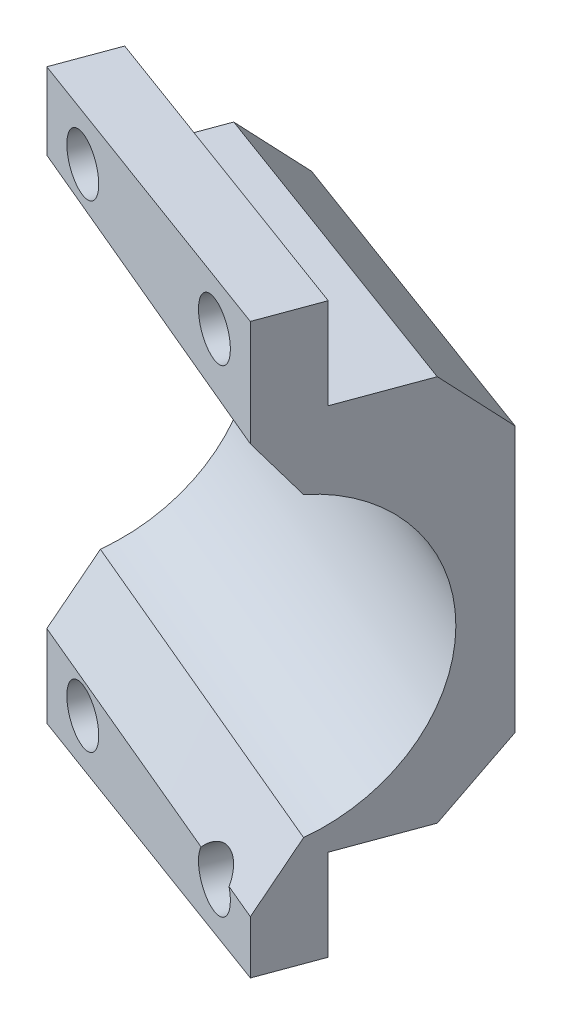
ISO-10303-21;
HEADER;
FILE_DESCRIPTION(('STEP AP214'),'2;1');
FILE_NAME('part.step','',(''),(''),'','','');
FILE_SCHEMA(('AUTOMOTIVE_DESIGN { 1 0 10303 214 1 1 1 1 }'));
ENDSEC;
DATA;
#1=APPLICATION_CONTEXT('core data for automotive mechanical design processes');
#2=APPLICATION_PROTOCOL_DEFINITION('international standard','automotive_design',2000,#1);
#3=PRODUCT_CONTEXT('',#1,'mechanical');
#4=PRODUCT('Part','Part','',(#3));
#5=PRODUCT_RELATED_PRODUCT_CATEGORY('part','',(#4));
#6=PRODUCT_DEFINITION_FORMATION('','',#4);
#7=PRODUCT_DEFINITION_CONTEXT('part definition',#1,'design');
#8=PRODUCT_DEFINITION('design','',#6,#7);
#9=PRODUCT_DEFINITION_SHAPE('','',#8);
#10=(LENGTH_UNIT() NAMED_UNIT(*) SI_UNIT(.MILLI.,.METRE.));
#11=(NAMED_UNIT(*) PLANE_ANGLE_UNIT() SI_UNIT($,.RADIAN.));
#12=(NAMED_UNIT(*) SI_UNIT($,.STERADIAN.) SOLID_ANGLE_UNIT());
#13=UNCERTAINTY_MEASURE_WITH_UNIT(LENGTH_MEASURE(1.E-05),#10,'distance_accuracy_value','');
#14=(GEOMETRIC_REPRESENTATION_CONTEXT(3) GLOBAL_UNCERTAINTY_ASSIGNED_CONTEXT((#13)) GLOBAL_UNIT_ASSIGNED_CONTEXT((#10,
#11,#12)) REPRESENTATION_CONTEXT('',''));
#15=CARTESIAN_POINT('',(0.,0.,0.));
#16=DIRECTION('',(0.,0.,1.));
#17=DIRECTION('',(1.,0.,0.));
#18=AXIS2_PLACEMENT_3D('',#15,#16,#17);
#19=CARTESIAN_POINT('',(5.20375513629735,0.,-14.1184087675292));
#20=DIRECTION('',(0.345836204768251,0.,-0.93829490005621));
#21=DIRECTION('',(-0.93829490005621,0.,-0.345836204768251));
#22=AXIS2_PLACEMENT_3D('',#19,#20,#21);
#23=PLANE('',#22);
#24=CARTESIAN_POINT('',(27.4328186314744,-21.59,-5.92523308868456));
#25=DIRECTION('',(0.345836204768251,0.,-0.93829490005621));
#26=DIRECTION('',(-0.93829490005621,0.,-0.345836204768251));
#27=AXIS2_PLACEMENT_3D('',#24,#25,#26);
#28=CIRCLE('',#27,2.25);
#29=CARTESIAN_POINT('',(25.6621337291462,-20.364749591954,-6.57787113075961));
#30=VERTEX_POINT('',#29);
#31=CARTESIAN_POINT('',(29.3712667732315,-20.6986727521681,-5.21076096649234));
#32=VERTEX_POINT('',#31);
#33=EDGE_CURVE('E65',#30,#32,#28,.F.);
#34=ORIENTED_EDGE('',*,*,#33,.F.);
#35=CARTESIAN_POINT('',(3.46373196602658,-18.366168036434,-14.7597455257054));
#36=CARTESIAN_POINT('',(13.5033515166797,-19.2701140406902,-11.0593482172398));
#37=CARTESIAN_POINT('',(23.5378133568784,-20.1735294221602,-7.36085193478292));
#38=CARTESIAN_POINT('',(33.5670066351622,-21.0764042007455,-3.66429753590347));
#39=B_SPLINE_CURVE_WITH_KNOTS('',3,(#35,#36,#37,#38),.UNSPECIFIED.,.F.,.F.,(4,4),
(4.4922717591255,4.49697220817853),.UNSPECIFIED.);
#40=CARTESIAN_POINT('',(5.20375513629734,-18.5228353608945,-14.1184087675292));
#41=VERTEX_POINT('',#40);
#42=EDGE_CURVE('E71',#30,#41,#39,.F.);
#43=ORIENTED_EDGE('',*,*,#42,.T.);
#44=DIRECTION('',(0.,1.,0.));
#45=VECTOR('',#44,1.);
#46=CARTESIAN_POINT('',(5.20375513629734,22.225,-14.1184087675292));
#47=LINE('',#46,#45);
#48=CARTESIAN_POINT('',(5.20375513629734,-25.4,-14.1184087675292));
#49=VERTEX_POINT('',#48);
#50=EDGE_CURVE('E386',#49,#41,#47,.T.);
#51=ORIENTED_EDGE('',*,*,#50,.F.);
#52=DIRECTION('',(-0.93829490005621,0.,-0.345836204768251));
#53=VECTOR('',#52,1.);
#54=CARTESIAN_POINT('',(32.19935672376,-25.4,-4.16838516846184));
#55=LINE('',#54,#53);
#56=CARTESIAN_POINT('',(32.19935672376,-25.4,-4.16838516846184));
#57=VERTEX_POINT('',#56);
#58=EDGE_CURVE('E385',#57,#49,#55,.T.);
#59=ORIENTED_EDGE('',*,*,#58,.F.);
#60=DIRECTION('',(0.,-1.,0.));
#61=VECTOR('',#60,1.);
#62=CARTESIAN_POINT('',(32.19935672376,22.225,-4.16838516846184));
#63=LINE('',#62,#61);
#64=CARTESIAN_POINT('',(32.19935672376,-20.95328156283,-4.16838516846184));
#65=VERTEX_POINT('',#64);
#66=EDGE_CURVE('E372',#65,#57,#63,.T.);
#67=ORIENTED_EDGE('',*,*,#66,.F.);
#68=CARTESIAN_POINT('',(3.46373196602658,-18.366168036434,-14.7597455257054));
#69=CARTESIAN_POINT('',(13.5033515166797,-19.2701140406902,-11.0593482172398));
#70=CARTESIAN_POINT('',(23.5378133568784,-20.1735294221602,-7.36085193478292));
#71=CARTESIAN_POINT('',(33.5670066351622,-21.0764042007455,-3.66429753590347));
#72=B_SPLINE_CURVE_WITH_KNOTS('',3,(#68,#69,#70,#71),.UNSPECIFIED.,.F.,.F.,(4,4),
(4.4922717591255,4.49697220817853),.UNSPECIFIED.);
#73=EDGE_CURVE('E163',#65,#32,#72,.F.);
#74=ORIENTED_EDGE('',*,*,#73,.T.);
#75=EDGE_LOOP('',(#34,#43,#51,#59,#67,#74));
#76=FACE_BOUND('',#75,.T.);
#77=CARTESIAN_POINT('',(9.9702932285829,-21.59,-12.3615608473065));
#78=DIRECTION('',(0.345836204768251,0.,-0.93829490005621));
#79=DIRECTION('',(-0.93829490005621,0.,-0.345836204768251));
#80=AXIS2_PLACEMENT_3D('',#77,#78,#79);
#81=CIRCLE('',#80,2.25);
#82=CARTESIAN_POINT('',(7.85912970345642,-21.59,-13.1396923080351));
#83=VERTEX_POINT('',#82);
#84=EDGE_CURVE('E674',#83,#83,#81,.T.);
#85=ORIENTED_EDGE('',*,*,#84,.T.);
#86=EDGE_LOOP('',(#85));
#87=FACE_BOUND('',#86,.T.);
#88=ADVANCED_FACE('F45',(#76,#87),#23,.F.);
#89=CARTESIAN_POINT('',(5.20375513629734,15.8068587575069,-14.1184087675292));
#90=VERTEX_POINT('',#89);
#91=CARTESIAN_POINT('',(5.20375513629734,22.225,-14.1184087675292));
#92=VERTEX_POINT('',#91);
#93=EDGE_CURVE('E309',#90,#92,#47,.T.);
#94=ORIENTED_EDGE('',*,*,#93,.F.);
#95=CARTESIAN_POINT('',(33.9426370998361,13.1854246984861,-3.52584787120819));
#96=CARTESIAN_POINT('',(23.9118310119001,14.100453866347,-7.22299671855917));
#97=CARTESIAN_POINT('',(13.8757578604912,15.0158971815855,-10.9220868971925));
#98=CARTESIAN_POINT('',(3.83452856638758,15.9317445265315,-14.6230775239907));
#99=B_SPLINE_CURVE_WITH_KNOTS('',3,(#95,#96,#97,#98),.UNSPECIFIED.,.F.,.F.,(4,4),
(1.78564339430034,1.79034493518094),.UNSPECIFIED.);
#100=CARTESIAN_POINT('',(32.19935672376,13.3444493750907,-4.16838516846184));
#101=VERTEX_POINT('',#100);
#102=EDGE_CURVE('E58',#90,#101,#99,.F.);
#103=ORIENTED_EDGE('',*,*,#102,.T.);
#104=CARTESIAN_POINT('',(32.19935672376,22.225,-4.16838516846184));
#105=VERTEX_POINT('',#104);
#106=EDGE_CURVE('E308',#105,#101,#63,.T.);
#107=ORIENTED_EDGE('',*,*,#106,.F.);
#108=DIRECTION('',(0.93829490005621,0.,0.345836204768251));
#109=VECTOR('',#108,1.);
#110=CARTESIAN_POINT('',(32.19935672376,22.225,-4.16838516846184));
#111=LINE('',#110,#109);
#112=EDGE_CURVE('E472',#92,#105,#111,.T.);
#113=ORIENTED_EDGE('',*,*,#112,.F.);
#114=EDGE_LOOP('',(#94,#103,#107,#113));
#115=FACE_BOUND('',#114,.T.);
#116=CARTESIAN_POINT('',(27.4328186314745,18.415,-5.92523308868456));
#117=DIRECTION('',(0.345836204768251,0.,-0.93829490005621));
#118=DIRECTION('',(-0.93829490005621,0.,-0.345836204768251));
#119=AXIS2_PLACEMENT_3D('',#116,#117,#118);
#120=CIRCLE('',#119,2.25);
#121=CARTESIAN_POINT('',(25.321655106348,18.415,-6.70336454941312));
#122=VERTEX_POINT('',#121);
#123=EDGE_CURVE('E459',#122,#122,#120,.F.);
#124=ORIENTED_EDGE('',*,*,#123,.F.);
#125=EDGE_LOOP('',(#124));
#126=FACE_BOUND('',#125,.T.);
#127=CARTESIAN_POINT('',(9.9702932285829,18.415,-12.3615608473065));
#128=DIRECTION('',(0.345836204768251,0.,-0.93829490005621));
#129=DIRECTION('',(-0.93829490005621,0.,-0.345836204768251));
#130=AXIS2_PLACEMENT_3D('',#127,#128,#129);
#131=CIRCLE('',#130,2.25);
#132=CARTESIAN_POINT('',(7.85912970345643,18.415,-13.1396923080351));
#133=VERTEX_POINT('',#132);
#134=EDGE_CURVE('E450',#133,#133,#131,.T.);
#135=ORIENTED_EDGE('',*,*,#134,.T.);
#136=EDGE_LOOP('',(#135));
#137=FACE_BOUND('',#136,.T.);
#138=ADVANCED_FACE('F305',(#115,#126,#137),#23,.F.);
#139=CARTESIAN_POINT('',(-32.5094030823979,22.225,-33.4327794489562));
#140=DIRECTION('',(-0.345836204768251,0.,0.93829490005621));
#141=DIRECTION('',(0.93829490005621,0.,0.345836204768251));
#142=AXIS2_PLACEMENT_3D('',#139,#140,#141);
#143=PLANE('',#142);
#144=DIRECTION('',(0.93829490005621,0.,0.345836204768251));
#145=VECTOR('',#144,1.);
#146=CARTESIAN_POINT('',(-32.5094030823979,14.605,-33.4327794489562));
#147=LINE('',#146,#145);
#148=CARTESIAN_POINT('',(6.96060305652006,14.605,-18.8849468598148));
#149=VERTEX_POINT('',#148);
#150=CARTESIAN_POINT('',(33.9562046439827,14.605,-8.93492326074739));
#151=VERTEX_POINT('',#150);
#152=EDGE_CURVE('E491',#149,#151,#147,.T.);
#153=ORIENTED_EDGE('',*,*,#152,.F.);
#154=DIRECTION('',(0.,-1.,0.));
#155=VECTOR('',#154,1.);
#156=CARTESIAN_POINT('',(6.96060305652005,22.225,-18.8849468598148));
#157=LINE('',#156,#155);
#158=CARTESIAN_POINT('',(6.96060305652006,22.225,-18.8849468598148));
#159=VERTEX_POINT('',#158);
#160=EDGE_CURVE('E384',#159,#149,#157,.T.);
#161=ORIENTED_EDGE('',*,*,#160,.F.);
#162=DIRECTION('',(0.93829490005621,0.,0.345836204768251));
#163=VECTOR('',#162,1.);
#164=CARTESIAN_POINT('',(-32.5094030823979,22.225,-33.4327794489562));
#165=LINE('',#164,#163);
#166=CARTESIAN_POINT('',(33.9562046439827,22.225,-8.93492326074739));
#167=VERTEX_POINT('',#166);
#168=EDGE_CURVE('E480',#159,#167,#165,.T.);
#169=ORIENTED_EDGE('',*,*,#168,.T.);
#170=DIRECTION('',(0.,1.,0.));
#171=VECTOR('',#170,1.);
#172=CARTESIAN_POINT('',(33.9562046439827,22.225,-8.93492326074739));
#173=LINE('',#172,#171);
#174=EDGE_CURVE('E474',#151,#167,#173,.T.);
#175=ORIENTED_EDGE('',*,*,#174,.F.);
#176=EDGE_LOOP('',(#153,#161,#169,#175));
#177=FACE_BOUND('',#176,.T.);
#178=CARTESIAN_POINT('',(29.1896665516972,18.415,-10.6917711809701));
#179=DIRECTION('',(-0.345836204768251,0.,0.93829490005621));
#180=DIRECTION('',(0.93829490005621,0.,0.345836204768251));
#181=AXIS2_PLACEMENT_3D('',#178,#179,#180);
#182=CIRCLE('',#181,2.25);
#183=CARTESIAN_POINT('',(31.3008300768236,18.415,-9.91363972024154));
#184=VERTEX_POINT('',#183);
#185=EDGE_CURVE('E675',#184,#184,#182,.F.);
#186=ORIENTED_EDGE('',*,*,#185,.F.);
#187=EDGE_LOOP('',(#186));
#188=FACE_BOUND('',#187,.T.);
#189=CARTESIAN_POINT('',(11.7271411488056,18.415,-17.1280989395921));
#190=DIRECTION('',(-0.345836204768251,0.,0.93829490005621));
#191=DIRECTION('',(0.93829490005621,0.,0.345836204768251));
#192=AXIS2_PLACEMENT_3D('',#189,#190,#191);
#193=CIRCLE('',#192,2.25);
#194=CARTESIAN_POINT('',(13.8383046739321,18.415,-16.3499674788635));
#195=VERTEX_POINT('',#194);
#196=EDGE_CURVE('E53',#195,#195,#193,.T.);
#197=ORIENTED_EDGE('',*,*,#196,.T.);
#198=EDGE_LOOP('',(#197));
#199=FACE_BOUND('',#198,.T.);
#200=ADVANCED_FACE('F522',(#177,#188,#199),#143,.F.);
#201=CARTESIAN_POINT('',(-32.5094030823979,-25.4,-33.4327794489562));
#202=DIRECTION('',(-0.345836204768251,0.,0.93829490005621));
#203=DIRECTION('',(0.93829490005621,0.,0.345836204768251));
#204=AXIS2_PLACEMENT_3D('',#201,#202,#203);
#205=PLANE('',#204);
#206=DIRECTION('',(0.93829490005621,0.,0.345836204768251));
#207=VECTOR('',#206,1.);
#208=CARTESIAN_POINT('',(-32.5094030823979,-25.4,-33.4327794489562));
#209=LINE('',#208,#207);
#210=CARTESIAN_POINT('',(6.96060305652006,-25.4,-18.8849468598148));
#211=VERTEX_POINT('',#210);
#212=CARTESIAN_POINT('',(33.9562046439827,-25.4,-8.93492326074739));
#213=VERTEX_POINT('',#212);
#214=EDGE_CURVE('E321',#211,#213,#209,.T.);
#215=ORIENTED_EDGE('',*,*,#214,.F.);
#216=DIRECTION('',(0.,-1.,0.));
#217=VECTOR('',#216,1.);
#218=CARTESIAN_POINT('',(6.96060305652005,22.225,-18.8849468598148));
#219=LINE('',#218,#217);
#220=CARTESIAN_POINT('',(6.96060305652006,-17.78,-18.8849468598148));
#221=VERTEX_POINT('',#220);
#222=EDGE_CURVE('E463',#221,#211,#219,.T.);
#223=ORIENTED_EDGE('',*,*,#222,.F.);
#224=DIRECTION('',(0.93829490005621,0.,0.345836204768251));
#225=VECTOR('',#224,1.);
#226=CARTESIAN_POINT('',(-32.5094030823979,-17.78,-33.4327794489562));
#227=LINE('',#226,#225);
#228=CARTESIAN_POINT('',(33.9562046439827,-17.78,-8.93492326074739));
#229=VERTEX_POINT('',#228);
#230=EDGE_CURVE('E371',#221,#229,#227,.T.);
#231=ORIENTED_EDGE('',*,*,#230,.T.);
#232=DIRECTION('',(0.,1.,0.));
#233=VECTOR('',#232,1.);
#234=CARTESIAN_POINT('',(33.9562046439827,22.225,-8.93492326074739));
#235=LINE('',#234,#233);
#236=EDGE_CURVE('E449',#213,#229,#235,.T.);
#237=ORIENTED_EDGE('',*,*,#236,.F.);
#238=EDGE_LOOP('',(#215,#223,#231,#237));
#239=FACE_BOUND('',#238,.T.);
#240=CARTESIAN_POINT('',(29.1896665516972,-21.59,-10.6917711809701));
#241=DIRECTION('',(-0.345836204768251,0.,0.93829490005621));
#242=DIRECTION('',(0.93829490005621,0.,0.345836204768251));
#243=AXIS2_PLACEMENT_3D('',#240,#241,#242);
#244=CIRCLE('',#243,2.25);
#245=CARTESIAN_POINT('',(31.3008300768236,-21.59,-9.91363972024154));
#246=VERTEX_POINT('',#245);
#247=EDGE_CURVE('E165',#246,#246,#244,.F.);
#248=ORIENTED_EDGE('',*,*,#247,.F.);
#249=EDGE_LOOP('',(#248));
#250=FACE_BOUND('',#249,.T.);
#251=CARTESIAN_POINT('',(11.7271411488056,-21.59,-17.1280989395921));
#252=DIRECTION('',(-0.345836204768251,0.,0.93829490005621));
#253=DIRECTION('',(0.93829490005621,0.,0.345836204768251));
#254=AXIS2_PLACEMENT_3D('',#251,#252,#253);
#255=CIRCLE('',#254,2.25);
#256=CARTESIAN_POINT('',(13.8383046739321,-21.59,-16.3499674788635));
#257=VERTEX_POINT('',#256);
#258=EDGE_CURVE('E672',#257,#257,#255,.T.);
#259=ORIENTED_EDGE('',*,*,#258,.T.);
#260=EDGE_LOOP('',(#259));
#261=FACE_BOUND('',#260,.T.);
#262=ADVANCED_FACE('F200',(#239,#250,#261),#205,.F.);
#263=CARTESIAN_POINT('',(33.5670066351622,-21.0764042007455,-3.66429753590347));
#264=CARTESIAN_POINT('',(23.5378133568784,-20.1735294221602,-7.36085193478292));
#265=CARTESIAN_POINT('',(13.5033515166797,-19.2701140406902,-11.0593482172398));
#266=CARTESIAN_POINT('',(3.46373196602658,-18.366168036434,-14.7597455257054));
#267=CARTESIAN_POINT('',(35.1379538160594,-16.4005520931051,-6.78439877780083));
#268=CARTESIAN_POINT('',(25.1114511492865,-15.4960397642799,-10.4877972476159));
#269=CARTESIAN_POINT('',(15.079679892982,-14.5910040508271,-14.1931417316007));
#270=CARTESIAN_POINT('',(5.04275086888381,-13.685454950745,-17.9003912965337));
#271=B_SPLINE_SURFACE_WITH_KNOTS('',1,3,((#263,#264,#265,#266),(#267,#268,#269,#270)),
.UNSPECIFIED.,.F.,.F.,.F.,(2,2),(4,4),(0.,1.),(4.4922717591255,4.49697220817853),.UNSPECIFIED.);
#272=CARTESIAN_POINT('',(25.6621294918352,-20.3647565473604,-6.57787269254533));
#273=CARTESIAN_POINT('',(25.7554121974584,-20.2585146460884,-6.63164108777216));
#274=CARTESIAN_POINT('',(25.8574691335113,-20.1563358413693,-6.67965572751386));
#275=CARTESIAN_POINT('',(26.0782003819209,-19.9635909658211,-6.76177425449963));
#276=CARTESIAN_POINT('',(26.1969807828099,-19.8731067200503,-6.7957834201934));
#277=CARTESIAN_POINT('',(26.4258972472953,-19.7237940881874,-6.8420428091694));
#278=CARTESIAN_POINT('',(26.533640008799,-19.6622027971916,-6.85713528486028));
#279=CARTESIAN_POINT('',(26.7568631349381,-19.5529813804391,-6.87426391983681));
#280=CARTESIAN_POINT('',(26.8723251278852,-19.505319461112,-6.87633003707949));
#281=CARTESIAN_POINT('',(27.0496910650771,-19.4462032343245,-6.86866063265423));
#282=CARTESIAN_POINT('',(27.1098220208426,-19.4285032828833,-6.86425957115633));
#283=CARTESIAN_POINT('',(27.2308507939641,-19.3976959300964,-6.85169600050749));
#284=CARTESIAN_POINT('',(27.291748191475,-19.3845861188529,-6.84353547036587));
#285=CARTESIAN_POINT('',(27.4137689759192,-19.3632545326066,-6.82338804274732));
#286=CARTESIAN_POINT('',(27.4748923472148,-19.3550324255109,-6.81140140531879));
#287=CARTESIAN_POINT('',(27.5967243289433,-19.3436901531479,-6.78362954600775));
#288=CARTESIAN_POINT('',(27.6574330078001,-19.3405691249154,-6.76784496715322));
#289=CARTESIAN_POINT('',(27.82125429951,-19.3392176536223,-6.71981458242317));
#290=CARTESIAN_POINT('',(27.9234100676175,-19.3461297694335,-6.68390168924525));
#291=CARTESIAN_POINT('',(28.121238943341,-19.3753761184677,-6.60216278040206));
#292=CARTESIAN_POINT('',(28.2169142979926,-19.3977049756765,-6.55634022418689));
#293=CARTESIAN_POINT('',(28.3942387730919,-19.4550502831308,-6.45914537122653));
#294=CARTESIAN_POINT('',(28.4763634659916,-19.4893279261559,-6.40819844644321));
#295=CARTESIAN_POINT('',(28.630776226643,-19.5691288043763,-6.30060939799221));
#296=CARTESIAN_POINT('',(28.7030630616304,-19.614653446904,-6.24396656212381));
#297=CARTESIAN_POINT('',(28.8420734950818,-19.7190712154906,-6.12207496939455));
#298=CARTESIAN_POINT('',(28.907933945327,-19.7787261464829,-6.05649944309361));
#299=CARTESIAN_POINT('',(29.0269109364636,-19.9069466424569,-5.92232044627046));
#300=CARTESIAN_POINT('',(29.0800004551393,-19.9755306364461,-5.85371091268858));
#301=CARTESIAN_POINT('',(29.1810878382447,-20.131364298895,-5.70367532220344));
#302=CARTESIAN_POINT('',(29.2268207433501,-20.2198301565201,-5.62199355269249));
#303=CARTESIAN_POINT('',(29.3016027091709,-20.4032841635773,-5.45861830670346));
#304=CARTESIAN_POINT('',(29.3306685896978,-20.4982656288771,-5.37692492554114));
#305=CARTESIAN_POINT('',(29.3592861985037,-20.629591344229,-5.26743891645888));
#306=CARTESIAN_POINT('',(29.3657551764665,-20.6640253914846,-5.23904134714636));
#307=CARTESIAN_POINT('',(29.371266182945,-20.6986801989754,-5.21076118405995));
#308=B_SPLINE_CURVE_WITH_KNOTS('',3,(#272,#273,#274,#275,#276,#277,#278,#279,#280,#281,#282,
#283,#284,#285,#286,#287,#288,#289,#290,#291,#292,#293,#294,#295,#296,#297,#298,#299,#300,#301,
#302,#303,#304,#305,#306,#307),.UNSPECIFIED.,.F.,.F.,(4,2,2,2,2,2,2,2,2,2,2,2,2,2,2,2,2,4),(0.,
0.454203843545623,0.911431005882664,1.28502001431848,1.65774953017867,1.84601998682151,
2.03419144968865,2.2223501258595,2.41047696734788,2.73412321220879,3.05765665446004,
3.36396456043671,3.6703108140295,4.00035913514037,4.33109978615035,4.71611176536682,
5.10073451628394,5.23597847049523),.UNSPECIFIED.);
#309=EDGE_CURVE('E11',#30,#32,#308,.T.);
#310=CARTESIAN_POINT('',(32.1993567237602,-20.95328156283,-4.16838516846184));
#311=CARTESIAN_POINT('',(32.2493858908594,-20.7570539979853,-4.30412066357207));
#312=CARTESIAN_POINT('',(32.2994153387784,-20.5608269977136,-4.43985687135961));
#313=CARTESIAN_POINT('',(32.3994752453252,-20.1683723649068,-4.71133193068998));
#314=CARTESIAN_POINT('',(32.449505703958,-19.9721447323818,-4.84707078224559));
#315=CARTESIAN_POINT('',(32.5495676319295,-19.5796888350989,-5.11855112912046));
#316=CARTESIAN_POINT('',(32.5995991012731,-19.3834605703511,-5.25429262445251));
#317=CARTESIAN_POINT('',(32.6996630506748,-18.9910034086537,-5.52577825888456));
#318=CARTESIAN_POINT('',(32.7496955307379,-18.7947745117142,-5.66152239799734));
#319=CARTESIAN_POINT('',(32.8497615015742,-18.402316085664,-5.93301331999965));
#320=CARTESIAN_POINT('',(32.8997949923523,-18.2060865565633,-6.06876010290197));
#321=CARTESIAN_POINT('',(32.9998629846208,-17.8136268662212,-6.34025631248994));
#322=CARTESIAN_POINT('',(33.0498974861162,-17.61739670499,-6.47600573918839));
#323=CARTESIAN_POINT('',(33.1499674998195,-17.2249357504176,-6.74750723637576));
#324=CARTESIAN_POINT('',(33.2000030120324,-17.0287049570866,-6.88325930687748));
#325=CARTESIAN_POINT('',(33.3000750471718,-16.6362427383452,-7.15476609167844));
#326=CARTESIAN_POINT('',(33.3501115701031,-16.4400113129451,-7.29052080599045));
#327=CARTESIAN_POINT('',(33.400148373835,-16.2437804521713,-7.42627623295744));
#328=B_SPLINE_CURVE_WITH_KNOTS('',3,(#310,#311,#312,#313,#314,#315,#316,#317,#318,#319,#320,
#321,#322,#323,#324,#325,#326,#327),.UNSPECIFIED.,.F.,.F.,(4,2,2,2,2,2,2,2,4),(0.,
0.731362218454331,1.46273100190098,2.19410635032304,2.92548826370239,3.65687674202213,
4.38827178526495,5.11967339341355,5.85108156645062),.UNSPECIFIED.);
#329=CARTESIAN_POINT('',(33.4001483738331,-16.243780452169,-7.42627623295755));
#330=VERTEX_POINT('',#329);
#331=EDGE_CURVE('E233',#330,#65,#328,.F.);
#332=CARTESIAN_POINT('',(35.1379538160594,-16.4005520931051,-6.78439877780083));
#333=CARTESIAN_POINT('',(25.1114511492865,-15.4960397642799,-10.4877972476159));
#334=CARTESIAN_POINT('',(15.079679892982,-14.5910040508271,-14.1931417316007));
#335=CARTESIAN_POINT('',(5.04275086888381,-13.685454950745,-17.9003912965337));
#336=B_SPLINE_CURVE_WITH_KNOTS('',3,(#332,#333,#334,#335),.UNSPECIFIED.,.F.,.F.,(4,4),
(4.4922717591255,4.49697220817853),.UNSPECIFIED.);
#337=CARTESIAN_POINT('',(6.41139102828688,-13.8089357358303,-17.394869077224));
#338=VERTEX_POINT('',#337);
#339=EDGE_CURVE('E173',#338,#330,#336,.F.);
#340=CARTESIAN_POINT('',(6.41139102828642,-13.8089357358321,-17.3948690772246));
#341=CARTESIAN_POINT('',(6.36106904585803,-14.0053498234731,-17.2583399206268));
#342=CARTESIAN_POINT('',(6.31074734418016,-14.2017644788184,-17.1218114772626));
#343=CARTESIAN_POINT('',(6.21010495212126,-14.594593169304,-16.8487572373571));
#344=CARTESIAN_POINT('',(6.15978426173519,-14.7910072044342,-16.7122314408029));
#345=CARTESIAN_POINT('',(6.05914389225399,-15.1838346544585,-16.4391824945121));
#346=CARTESIAN_POINT('',(6.00882421315383,-15.3802480693425,-16.3026593447628));
#347=CARTESIAN_POINT('',(5.90818586624679,-15.773074278844,-16.0296156920737));
#348=CARTESIAN_POINT('',(5.85786719843489,-15.9694870734513,-15.8930951891212));
#349=CARTESIAN_POINT('',(5.75723087410806,-16.3623120423689,-15.6200568300175));
#350=CARTESIAN_POINT('',(5.70691321758812,-16.558724216669,-15.4835389738534));
#351=CARTESIAN_POINT('',(5.60627891583525,-16.951547944941,-15.2105059083227));
#352=CARTESIAN_POINT('',(5.55596227059729,-17.1479594989028,-15.0739906989433));
#353=CARTESIAN_POINT('',(5.45532999141736,-17.5407819864677,-14.8009629269718));
#354=CARTESIAN_POINT('',(5.40501435747037,-17.7371929200608,-14.6644503643669));
#355=CARTESIAN_POINT('',(5.30438410086515,-18.1300141668574,-14.3914278859395));
#356=CARTESIAN_POINT('',(5.25406947820191,-18.3264244800508,-14.2549179701044));
#357=CARTESIAN_POINT('',(5.20375513629885,-18.5228353608946,-14.1184087675287));
#358=B_SPLINE_CURVE_WITH_KNOTS('',3,(#340,#341,#342,#343,#344,#345,#346,#347,#348,#349,#350,
#351,#352,#353,#354,#355,#356,#357),.UNSPECIFIED.,.F.,.F.,(4,2,2,2,2,2,2,2,4),(0.,
0.733320569098762,1.46663458356008,2.19994204336577,2.93324294849886,3.66653729894241,
4.39982509467822,5.13310633568975,5.86638102195881),.UNSPECIFIED.);
#359=EDGE_CURVE('E171',#41,#338,#358,.F.);
#360=ORIENTED_EDGE('',*,*,#42,.F.);
#361=ORIENTED_EDGE('',*,*,#309,.T.);
#362=ORIENTED_EDGE('',*,*,#73,.F.);
#363=ORIENTED_EDGE('',*,*,#331,.F.);
#364=ORIENTED_EDGE('',*,*,#339,.F.);
#365=ORIENTED_EDGE('',*,*,#359,.F.);
#366=EDGE_LOOP('',(#360,#361,#362,#363,#364,#365));
#367=FACE_BOUND('',#366,.T.);
#368=ADVANCED_FACE('F169',(#367),#271,.T.);
#369=CARTESIAN_POINT('',(38.1726396525172,22.225,-20.3746146822327));
#370=DIRECTION('',(-0.93829490005621,0.,-0.345836204768251));
#371=DIRECTION('',(-0.345836204768251,0.,0.93829490005621));
#372=AXIS2_PLACEMENT_3D('',#369,#370,#371);
#373=PLANE('',#372);
#374=DIRECTION('',(0.345836204768251,0.,-0.93829490005621));
#375=VECTOR('',#374,1.);
#376=CARTESIAN_POINT('',(38.1726396525172,-17.78,-20.3746146822327));
#377=LINE('',#376,#375);
#378=CARTESIAN_POINT('',(36.4157917322945,-17.78,-15.6080765899471));
#379=VERTEX_POINT('',#378);
#380=EDGE_CURVE('E452',#229,#379,#377,.T.);
#381=ORIENTED_EDGE('',*,*,#380,.T.);
#382=DIRECTION('',(0.244543125571449,0.707106781186549,-0.663474686582499));
#383=VECTOR('',#382,1.);
#384=CARTESIAN_POINT('',(36.4157917322945,-17.78,-15.6080765899471));
#385=LINE('',#384,#383);
#386=CARTESIAN_POINT('',(38.1726396525172,-12.7,-20.3746146822327));
#387=VERTEX_POINT('',#386);
#388=EDGE_CURVE('E423',#379,#387,#385,.T.);
#389=ORIENTED_EDGE('',*,*,#388,.T.);
#390=DIRECTION('',(0.,-1.,0.));
#391=VECTOR('',#390,1.);
#392=CARTESIAN_POINT('',(38.1726396525172,22.225,-20.3746146822327));
#393=LINE('',#392,#391);
#394=CARTESIAN_POINT('',(38.1726396525172,9.52499999999998,-20.3746146822327));
#395=VERTEX_POINT('',#394);
#396=EDGE_CURVE('E479',#395,#387,#393,.T.);
#397=ORIENTED_EDGE('',*,*,#396,.F.);
#398=DIRECTION('',(-0.244543125571449,0.707106781186549,0.663474686582498));
#399=VECTOR('',#398,1.);
#400=CARTESIAN_POINT('',(36.4157917322945,14.605,-15.6080765899472));
#401=LINE('',#400,#399);
#402=CARTESIAN_POINT('',(36.4157917322945,14.605,-15.6080765899472));
#403=VERTEX_POINT('',#402);
#404=EDGE_CURVE('E356',#395,#403,#401,.T.);
#405=ORIENTED_EDGE('',*,*,#404,.T.);
#406=DIRECTION('',(-0.345836204768251,0.,0.93829490005621));
#407=VECTOR('',#406,1.);
#408=CARTESIAN_POINT('',(38.1726396525172,14.605,-20.3746146822327));
#409=LINE('',#408,#407);
#410=EDGE_CURVE('E483',#403,#151,#409,.T.);
#411=ORIENTED_EDGE('',*,*,#410,.T.);
#412=ORIENTED_EDGE('',*,*,#174,.T.);
#413=DIRECTION('',(-0.345836204768251,0.,0.93829490005621));
#414=VECTOR('',#413,1.);
#415=CARTESIAN_POINT('',(38.1726396525172,22.225,-20.3746146822327));
#416=LINE('',#415,#414);
#417=EDGE_CURVE('E319',#167,#105,#416,.T.);
#418=ORIENTED_EDGE('',*,*,#417,.T.);
#419=ORIENTED_EDGE('',*,*,#106,.T.);
#420=CARTESIAN_POINT('',(33.399778270827,8.63574324899452,-7.42527209932784));
#421=CARTESIAN_POINT('',(33.349764369973,8.83193767212167,-7.28957864531028));
#422=CARTESIAN_POINT('',(33.2997502100463,9.02813152332155,-7.15388445985211));
#423=CARTESIAN_POINT('',(33.1997209174812,9.420519865048,-6.88249339277062));
#424=CARTESIAN_POINT('',(33.1497057848382,9.61671435556419,-6.74679651113401));
#425=CARTESIAN_POINT('',(33.0496745468364,10.0091039758918,-6.47540005168967));
#426=CARTESIAN_POINT('',(32.999658441473,10.2052991056928,-6.33970047386864));
#427=CARTESIAN_POINT('',(32.8996252580263,10.5976900045586,-6.06829862204951));
#428=CARTESIAN_POINT('',(32.8496081799383,10.7938857736129,-5.9325963480381));
#429=CARTESIAN_POINT('',(32.7495730510384,11.1862779509539,-5.66118910383221));
#430=CARTESIAN_POINT('',(32.6995550002218,11.3824743592302,-5.52548413362444));
#431=CARTESIAN_POINT('',(32.5995179258605,11.7748678149834,-5.25407149701987));
#432=CARTESIAN_POINT('',(32.5494989023111,11.97106486245,-5.11836383060977));
#433=CARTESIAN_POINT('',(32.4494598824803,12.3634595965526,-4.84694580159456));
#434=CARTESIAN_POINT('',(32.399439886194,12.5596572831781,-4.71123543897616));
#435=CARTESIAN_POINT('',(32.2993989208853,12.9520532955669,-4.43981201753838));
#436=CARTESIAN_POINT('',(32.2493779518581,13.1482516213199,-4.3040989587057));
#437=CARTESIAN_POINT('',(32.1993567237605,13.3444493750907,-4.16838516846181));
#438=B_SPLINE_CURVE_WITH_KNOTS('',3,(#420,#421,#422,#423,#424,#425,#426,#427,#428,#429,#430,
#431,#432,#433,#434,#435,#436,#437),.UNSPECIFIED.,.F.,.F.,(4,2,2,2,2,2,2,2,4),(0.,
0.731202570201719,1.46241178621435,2.19362764802014,2.9248501556013,3.65607930894008,
4.38731510801872,5.11855755281943,5.84980664332446),.UNSPECIFIED.);
#439=CARTESIAN_POINT('',(33.3997782708264,8.63574324899266,-7.42527209932761));
#440=VERTEX_POINT('',#439);
#441=EDGE_CURVE('E315',#101,#440,#438,.F.);
#442=ORIENTED_EDGE('',*,*,#441,.T.);
#443=CARTESIAN_POINT('',(32.4432259005328,-3.80472765103727,-4.83003135151575));
#444=DIRECTION('',(-0.93829490005621,0.,-0.345836204768251));
#445=DIRECTION('',(0.01018251460173,0.999566455853083,-0.0276263774261387));
#446=AXIS2_PLACEMENT_3D('',#443,#444,#445);
#447=ELLIPSE('',#446,12.7458703931447,12.7);
#448=EDGE_CURVE('E363',#330,#440,#447,.F.);
#449=ORIENTED_EDGE('',*,*,#448,.F.);
#450=ORIENTED_EDGE('',*,*,#331,.T.);
#451=ORIENTED_EDGE('',*,*,#66,.T.);
#452=DIRECTION('',(-0.345836204768251,0.,0.93829490005621));
#453=VECTOR('',#452,1.);
#454=CARTESIAN_POINT('',(38.1726396525172,-25.4,-20.3746146822327));
#455=LINE('',#454,#453);
#456=EDGE_CURVE('E467',#213,#57,#455,.T.);
#457=ORIENTED_EDGE('',*,*,#456,.F.);
#458=ORIENTED_EDGE('',*,*,#236,.T.);
#459=EDGE_LOOP('',(#381,#389,#397,#405,#411,#412,#418,#419,#442,#449,#450,#451,#457,#458));
#460=FACE_BOUND('',#459,.T.);
#461=ADVANCED_FACE('F199',(#460),#373,.F.);
#462=CARTESIAN_POINT('',(38.1726396525172,-25.4,-20.3746146822327));
#463=DIRECTION('',(0.,1.,0.));
#464=DIRECTION('',(0.,0.,1.));
#465=AXIS2_PLACEMENT_3D('',#462,#463,#464);
#466=PLANE('',#465);
#467=DIRECTION('',(-0.345836204768251,0.,0.93829490005621));
#468=VECTOR('',#467,1.);
#469=CARTESIAN_POINT('',(11.1770380650546,-25.4,-30.3246382813001));
#470=LINE('',#469,#468);
#471=EDGE_CURVE('E389',#211,#49,#470,.T.);
#472=ORIENTED_EDGE('',*,*,#471,.F.);
#473=ORIENTED_EDGE('',*,*,#214,.T.);
#474=ORIENTED_EDGE('',*,*,#456,.T.);
#475=ORIENTED_EDGE('',*,*,#58,.T.);
#476=EDGE_LOOP('',(#472,#473,#474,#475));
#477=FACE_BOUND('',#476,.T.);
#478=ADVANCED_FACE('F407',(#477),#466,.F.);
#479=CARTESIAN_POINT('',(11.1770380650546,22.225,-30.3246382813001));
#480=DIRECTION('',(0.93829490005621,0.,0.345836204768251));
#481=DIRECTION('',(0.345836204768251,0.,-0.93829490005621));
#482=AXIS2_PLACEMENT_3D('',#479,#480,#481);
#483=PLANE('',#482);
#484=DIRECTION('',(0.,1.,0.));
#485=VECTOR('',#484,1.);
#486=CARTESIAN_POINT('',(11.1770380650546,22.225,-30.3246382813001));
#487=LINE('',#486,#485);
#488=CARTESIAN_POINT('',(11.1770380650546,-12.7,-30.3246382813001));
#489=VERTEX_POINT('',#488);
#490=CARTESIAN_POINT('',(11.1770380650546,9.52499999999998,-30.3246382813001));
#491=VERTEX_POINT('',#490);
#492=EDGE_CURVE('E476',#489,#491,#487,.T.);
#493=ORIENTED_EDGE('',*,*,#492,.F.);
#494=DIRECTION('',(-0.244543125571449,-0.707106781186549,0.663474686582499));
#495=VECTOR('',#494,1.);
#496=CARTESIAN_POINT('',(9.42019014483185,-17.78,-25.5581001890145));
#497=LINE('',#496,#495);
#498=CARTESIAN_POINT('',(9.42019014483185,-17.78,-25.5581001890145));
#499=VERTEX_POINT('',#498);
#500=EDGE_CURVE('E246',#489,#499,#497,.T.);
#501=ORIENTED_EDGE('',*,*,#500,.T.);
#502=DIRECTION('',(-0.345836204768251,0.,0.93829490005621));
#503=VECTOR('',#502,1.);
#504=CARTESIAN_POINT('',(11.1770380650546,-17.78,-30.3246382813001));
#505=LINE('',#504,#503);
#506=EDGE_CURVE('E466',#499,#221,#505,.T.);
#507=ORIENTED_EDGE('',*,*,#506,.T.);
#508=ORIENTED_EDGE('',*,*,#222,.T.);
#509=ORIENTED_EDGE('',*,*,#471,.T.);
#510=ORIENTED_EDGE('',*,*,#50,.T.);
#511=ORIENTED_EDGE('',*,*,#359,.T.);
#512=CARTESIAN_POINT('',(5.47254613917725,-1.35827681156377,-14.8476708393017));
#513=DIRECTION('',(0.93829490005621,0.,0.345836204768251));
#514=DIRECTION('',(0.01018251460173,0.999566455853083,-0.0276263774261387));
#515=AXIS2_PLACEMENT_3D('',#512,#513,#514);
#516=ELLIPSE('',#515,12.7458703931447,12.7);
#517=CARTESIAN_POINT('',(6.41101951664504,11.0937740908458,-17.3938611217987));
#518=VERTEX_POINT('',#517);
#519=EDGE_CURVE('E358',#518,#338,#516,.F.);
#520=ORIENTED_EDGE('',*,*,#519,.F.);
#521=CARTESIAN_POINT('',(5.2037551362977,15.8068587575069,-14.1184087675292));
#522=CARTESIAN_POINT('',(5.25406148726973,15.6104786101076,-14.2548961242137));
#523=CARTESIAN_POINT('',(5.30436757881801,15.4140978877593,-14.3913827492708));
#524=CARTESIAN_POINT('',(5.40497878789292,15.0213370700099,-14.6643533011817));
#525=CARTESIAN_POINT('',(5.45528390542425,14.8249569746191,-14.8008372280487));
#526=CARTESIAN_POINT('',(5.55589316646893,14.4321974108159,-15.0738023835852));
#527=CARTESIAN_POINT('',(5.60619730998697,14.235817942414,-15.210283612268));
#528=CARTESIAN_POINT('',(5.70680462300834,13.8430596326203,-15.4832433714423));
#529=CARTESIAN_POINT('',(5.75710779251637,13.6466807912389,-15.6197219019471));
#530=CARTESIAN_POINT('',(5.85771315752251,13.2539237355176,-15.8926762647709));
#531=CARTESIAN_POINT('',(5.90801535302532,13.0575455211882,-16.0291520971032));
#532=CARTESIAN_POINT('',(6.0086187700258,12.6647897196022,-16.3021010635877));
#533=CARTESIAN_POINT('',(6.05891999152817,12.4684121323561,-16.4385741977531));
#534=CARTESIAN_POINT('',(6.15952146053107,12.0756575849685,-16.71151776791));
#535=CARTESIAN_POINT('',(6.20982170803629,11.8792806248374,-16.8479882039147));
#536=CARTESIAN_POINT('',(6.31042122904854,11.4865273317112,-17.120926377756));
#537=CARTESIAN_POINT('',(6.36072050256026,11.2901509987266,-17.257394115606));
#538=CARTESIAN_POINT('',(6.41101951664504,11.093774090848,-17.3938611217993));
#539=B_SPLINE_CURVE_WITH_KNOTS('',3,(#521,#522,#523,#524,#525,#526,#527,#528,#529,#530,#531,
#532,#533,#534,#535,#536,#537,#538),.UNSPECIFIED.,.F.,.F.,(4,2,2,2,2,2,2,2,4),(0.,
0.733159060488279,1.46631148738602,2.19945728067529,2.93259644033817,3.66572896635695,
4.3988548587139,5.1319741173911,5.86508674237065),.UNSPECIFIED.);
#540=EDGE_CURVE('E392',#518,#90,#539,.F.);
#541=ORIENTED_EDGE('',*,*,#540,.T.);
#542=ORIENTED_EDGE('',*,*,#93,.T.);
#543=DIRECTION('',(-0.345836204768251,0.,0.93829490005621));
#544=VECTOR('',#543,1.);
#545=CARTESIAN_POINT('',(11.1770380650546,22.225,-30.3246382813001));
#546=LINE('',#545,#544);
#547=EDGE_CURVE('E388',#159,#92,#546,.T.);
#548=ORIENTED_EDGE('',*,*,#547,.F.);
#549=ORIENTED_EDGE('',*,*,#160,.T.);
#550=DIRECTION('',(0.345836204768251,0.,-0.93829490005621));
#551=VECTOR('',#550,1.);
#552=CARTESIAN_POINT('',(11.1770380650546,14.605,-30.3246382813001));
#553=LINE('',#552,#551);
#554=CARTESIAN_POINT('',(9.42019014483186,14.605,-25.5581001890145));
#555=VERTEX_POINT('',#554);
#556=EDGE_CURVE('E486',#149,#555,#553,.T.);
#557=ORIENTED_EDGE('',*,*,#556,.T.);
#558=DIRECTION('',(0.244543125571449,-0.707106781186549,-0.663474686582498));
#559=VECTOR('',#558,1.);
#560=CARTESIAN_POINT('',(9.42019014483186,14.605,-25.5581001890145));
#561=LINE('',#560,#559);
#562=EDGE_CURVE('E252',#555,#491,#561,.T.);
#563=ORIENTED_EDGE('',*,*,#562,.T.);
#564=EDGE_LOOP('',(#493,#501,#507,#508,#509,#510,#511,#520,#541,#542,#548,#549,#557,#563));
#565=FACE_BOUND('',#564,.T.);
#566=ADVANCED_FACE('F397',(#565),#483,.F.);
#567=CARTESIAN_POINT('',(38.1726396525172,22.225,-20.3746146822327));
#568=DIRECTION('',(0.,-1.,0.));
#569=DIRECTION('',(0.,0.,-1.));
#570=AXIS2_PLACEMENT_3D('',#567,#568,#569);
#571=PLANE('',#570);
#572=ORIENTED_EDGE('',*,*,#417,.F.);
#573=ORIENTED_EDGE('',*,*,#168,.F.);
#574=ORIENTED_EDGE('',*,*,#547,.T.);
#575=ORIENTED_EDGE('',*,*,#112,.T.);
#576=EDGE_LOOP('',(#572,#573,#574,#575));
#577=FACE_BOUND('',#576,.T.);
#578=ADVANCED_FACE('F406',(#577),#571,.F.);
#579=CARTESIAN_POINT('',(11.1770380650546,0.,-30.3246382813001));
#580=DIRECTION('',(0.345836204768251,0.,-0.93829490005621));
#581=DIRECTION('',(-0.93829490005621,0.,-0.345836204768251));
#582=AXIS2_PLACEMENT_3D('',#579,#580,#581);
#583=PLANE('',#582);
#584=ORIENTED_EDGE('',*,*,#396,.T.);
#585=DIRECTION('',(-0.93829490005621,0.,-0.345836204768251));
#586=VECTOR('',#585,1.);
#587=CARTESIAN_POINT('',(11.1770380650546,-12.7,-30.3246382813001));
#588=LINE('',#587,#586);
#589=EDGE_CURVE('E381',#387,#489,#588,.T.);
#590=ORIENTED_EDGE('',*,*,#589,.T.);
#591=ORIENTED_EDGE('',*,*,#492,.T.);
#592=DIRECTION('',(0.93829490005621,0.,0.345836204768251));
#593=VECTOR('',#592,1.);
#594=CARTESIAN_POINT('',(38.1726396525172,9.52499999999998,-20.3746146822327));
#595=LINE('',#594,#593);
#596=EDGE_CURVE('E419',#491,#395,#595,.T.);
#597=ORIENTED_EDGE('',*,*,#596,.T.);
#598=EDGE_LOOP('',(#584,#590,#591,#597));
#599=FACE_BOUND('',#598,.T.);
#600=ADVANCED_FACE('F505',(#599),#583,.T.);
#601=CARTESIAN_POINT('',(-28.2929680738634,14.605,-44.8724708704415));
#602=DIRECTION('',(0.,-1.,0.));
#603=DIRECTION('',(0.,0.,-1.));
#604=AXIS2_PLACEMENT_3D('',#601,#602,#603);
#605=PLANE('',#604);
#606=ORIENTED_EDGE('',*,*,#410,.F.);
#607=DIRECTION('',(-0.93829490005621,0.,-0.345836204768251));
#608=VECTOR('',#607,1.);
#609=CARTESIAN_POINT('',(9.42019014483185,14.605,-25.5581001890145));
#610=LINE('',#609,#608);
#611=EDGE_CURVE('E241',#403,#555,#610,.T.);
#612=ORIENTED_EDGE('',*,*,#611,.T.);
#613=ORIENTED_EDGE('',*,*,#556,.F.);
#614=ORIENTED_EDGE('',*,*,#152,.T.);
#615=EDGE_LOOP('',(#606,#612,#613,#614));
#616=FACE_BOUND('',#615,.T.);
#617=ADVANCED_FACE('F507',(#616),#605,.F.);
#618=CARTESIAN_POINT('',(-28.2929680738634,-17.78,-44.8724708704415));
#619=DIRECTION('',(0.,1.,0.));
#620=DIRECTION('',(0.,0.,1.));
#621=AXIS2_PLACEMENT_3D('',#618,#619,#620);
#622=PLANE('',#621);
#623=ORIENTED_EDGE('',*,*,#506,.F.);
#624=DIRECTION('',(0.93829490005621,0.,0.345836204768251));
#625=VECTOR('',#624,1.);
#626=CARTESIAN_POINT('',(36.4157917322945,-17.78,-15.6080765899471));
#627=LINE('',#626,#625);
#628=EDGE_CURVE('E325',#499,#379,#627,.T.);
#629=ORIENTED_EDGE('',*,*,#628,.T.);
#630=ORIENTED_EDGE('',*,*,#380,.F.);
#631=ORIENTED_EDGE('',*,*,#230,.F.);
#632=EDGE_LOOP('',(#623,#629,#630,#631));
#633=FACE_BOUND('',#632,.T.);
#634=ADVANCED_FACE('F271',(#633),#622,.F.);
#635=CARTESIAN_POINT('',(696.587375950818,-64.0477778002589,241.851057964544));
#636=DIRECTION('',(-0.934055024894211,0.0847260699391449,-0.34693328399354));
#637=DIRECTION('',(0.225267927018769,0.893590671610321,-0.388265466746249));
#638=AXIS2_PLACEMENT_3D('',#635,#636,#637);
#639=CYLINDRICAL_SURFACE('',#638,12.7);
#640=ORIENTED_EDGE('',*,*,#519,.T.);
#641=ORIENTED_EDGE('',*,*,#339,.T.);
#642=ORIENTED_EDGE('',*,*,#448,.T.);
#643=CARTESIAN_POINT('',(4.6665044886604,11.2526497357266,-18.0382165552068));
#644=CARTESIAN_POINT('',(14.7052990124899,10.3384041884104,-14.3302795685804));
#645=CARTESIAN_POINT('',(24.7389400835108,9.42457990900484,-10.6242460623342));
#646=CARTESIAN_POINT('',(34.7673168078248,8.51118699728635,-6.92015699632483));
#647=B_SPLINE_CURVE_WITH_KNOTS('',3,(#643,#644,#645,#646),.UNSPECIFIED.,.F.,.F.,(4,4),
(1.78564339430034,1.79034493518094),.UNSPECIFIED.);
#648=EDGE_CURVE('E239',#440,#518,#647,.F.);
#649=ORIENTED_EDGE('',*,*,#648,.T.);
#650=EDGE_LOOP('',(#640,#641,#642,#649));
#651=FACE_BOUND('',#650,.T.);
#652=ADVANCED_FACE('F260',(#651),#639,.F.);
#653=CARTESIAN_POINT('',(-30.0498159940861,-17.78,-40.105932778156));
#654=DIRECTION('',(0.24454312557145,-0.707106781186546,-0.663474686582501));
#655=DIRECTION('',(-0.93829490005621,0.,-0.345836204768251));
#656=AXIS2_PLACEMENT_3D('',#653,#654,#655);
#657=PLANE('',#656);
#658=ORIENTED_EDGE('',*,*,#500,.F.);
#659=ORIENTED_EDGE('',*,*,#589,.F.);
#660=ORIENTED_EDGE('',*,*,#388,.F.);
#661=ORIENTED_EDGE('',*,*,#628,.F.);
#662=EDGE_LOOP('',(#658,#659,#660,#661));
#663=FACE_BOUND('',#662,.T.);
#664=ADVANCED_FACE('F270',(#663),#657,.T.);
#665=CARTESIAN_POINT('',(-30.0498159940861,14.605,-40.105932778156));
#666=DIRECTION('',(0.24454312557145,0.707106781186546,-0.663474686582501));
#667=DIRECTION('',(0.93829490005621,0.,0.345836204768251));
#668=AXIS2_PLACEMENT_3D('',#665,#666,#667);
#669=PLANE('',#668);
#670=ORIENTED_EDGE('',*,*,#404,.F.);
#671=ORIENTED_EDGE('',*,*,#596,.F.);
#672=ORIENTED_EDGE('',*,*,#562,.F.);
#673=ORIENTED_EDGE('',*,*,#611,.F.);
#674=EDGE_LOOP('',(#670,#671,#672,#673));
#675=FACE_BOUND('',#674,.T.);
#676=ADVANCED_FACE('F201',(#675),#669,.T.);
#677=CARTESIAN_POINT('',(3.83452856638758,15.9317445265315,-14.6230775239907));
#678=CARTESIAN_POINT('',(13.8757578604912,15.0158971815855,-10.9220868971925));
#679=CARTESIAN_POINT('',(23.9118310119001,14.100453866347,-7.22299671855917));
#680=CARTESIAN_POINT('',(33.9426370998361,13.1854246984861,-3.52584787120819));
#681=CARTESIAN_POINT('',(4.6665044886604,11.2526497357266,-18.0382165552068));
#682=CARTESIAN_POINT('',(14.7052990124899,10.3384041884104,-14.3302795685804));
#683=CARTESIAN_POINT('',(24.7389400835108,9.42457990900484,-10.6242460623342));
#684=CARTESIAN_POINT('',(34.7673168078248,8.51118699728635,-6.92015699632483));
#685=B_SPLINE_SURFACE_WITH_KNOTS('',1,3,((#677,#678,#679,#680),(#681,#682,#683,#684)),
.UNSPECIFIED.,.F.,.F.,.F.,(2,2),(4,4),(0.,1.),(1.78564339430034,1.79034493518094),.UNSPECIFIED.);
#686=ORIENTED_EDGE('',*,*,#441,.F.);
#687=ORIENTED_EDGE('',*,*,#102,.F.);
#688=ORIENTED_EDGE('',*,*,#540,.F.);
#689=ORIENTED_EDGE('',*,*,#648,.F.);
#690=EDGE_LOOP('',(#686,#687,#688,#689));
#691=FACE_BOUND('',#690,.T.);
#692=ADVANCED_FACE('F48',(#691),#685,.T.);
#693=CARTESIAN_POINT('',(36.6348478725719,-21.59,-30.8914367077524));
#694=DIRECTION('',(-0.345836204768251,0.,0.938294900056209));
#695=DIRECTION('',(0.938294900056209,0.,0.345836204768251));
#696=AXIS2_PLACEMENT_3D('',#693,#694,#695);
#697=CYLINDRICAL_SURFACE('',#696,2.25);
#698=ORIENTED_EDGE('',*,*,#33,.T.);
#699=ORIENTED_EDGE('',*,*,#309,.F.);
#700=EDGE_LOOP('',(#698,#699));
#701=FACE_BOUND('',#700,.T.);
#702=ORIENTED_EDGE('',*,*,#247,.T.);
#703=EDGE_LOOP('',(#702));
#704=FACE_BOUND('',#703,.T.);
#705=ADVANCED_FACE('F156',(#701,#704),#697,.F.);
#706=CARTESIAN_POINT('',(19.1723224696803,-21.59,-37.3277644663744));
#707=DIRECTION('',(-0.345836204768251,0.,0.938294900056209));
#708=DIRECTION('',(0.938294900056209,0.,0.345836204768251));
#709=AXIS2_PLACEMENT_3D('',#706,#707,#708);
#710=CYLINDRICAL_SURFACE('',#709,2.25);
#711=ORIENTED_EDGE('',*,*,#258,.F.);
#712=EDGE_LOOP('',(#711));
#713=FACE_BOUND('',#712,.T.);
#714=ORIENTED_EDGE('',*,*,#84,.F.);
#715=EDGE_LOOP('',(#714));
#716=FACE_BOUND('',#715,.T.);
#717=ADVANCED_FACE('F576',(#713,#716),#710,.F.);
#718=CARTESIAN_POINT('',(36.6348478725719,18.415,-30.8914367077524));
#719=DIRECTION('',(-0.345836204768251,0.,0.938294900056209));
#720=DIRECTION('',(0.938294900056209,0.,0.345836204768251));
#721=AXIS2_PLACEMENT_3D('',#718,#719,#720);
#722=CYLINDRICAL_SURFACE('',#721,2.25);
#723=ORIENTED_EDGE('',*,*,#185,.T.);
#724=EDGE_LOOP('',(#723));
#725=FACE_BOUND('',#724,.T.);
#726=ORIENTED_EDGE('',*,*,#123,.T.);
#727=EDGE_LOOP('',(#726));
#728=FACE_BOUND('',#727,.T.);
#729=ADVANCED_FACE('F584',(#725,#728),#722,.F.);
#730=CARTESIAN_POINT('',(19.1723224696803,18.415,-37.3277644663744));
#731=DIRECTION('',(-0.345836204768251,0.,0.938294900056209));
#732=DIRECTION('',(0.938294900056209,0.,0.345836204768251));
#733=AXIS2_PLACEMENT_3D('',#730,#731,#732);
#734=CYLINDRICAL_SURFACE('',#733,2.25);
#735=ORIENTED_EDGE('',*,*,#196,.F.);
#736=EDGE_LOOP('',(#735));
#737=FACE_BOUND('',#736,.T.);
#738=ORIENTED_EDGE('',*,*,#134,.F.);
#739=EDGE_LOOP('',(#738));
#740=FACE_BOUND('',#739,.T.);
#741=ADVANCED_FACE('F593',(#737,#740),#734,.F.);
#742=CLOSED_SHELL('',(#88,#138,#200,#262,#368,#461,#478,#566,#578,#600,#617,#634,#652,#664,#676,
#692,#705,#717,#729,#741));
#743=MANIFOLD_SOLID_BREP('B2',#742);
#744=ADVANCED_BREP_SHAPE_REPRESENTATION('',(#18,#743),#14);
#745=SHAPE_DEFINITION_REPRESENTATION(#9,#744);
ENDSEC;
END-ISO-10303-21;
